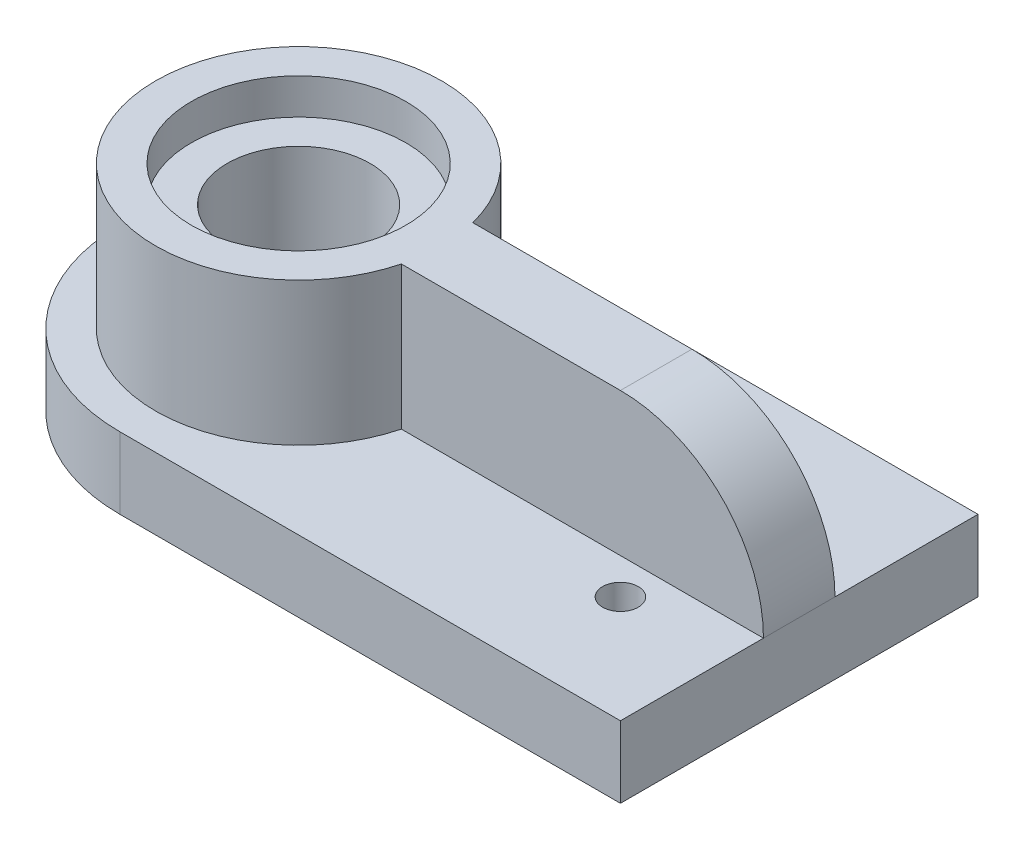
ISO-10303-21;
HEADER;
FILE_DESCRIPTION(('STEP AP214'),'2;1');
FILE_NAME('part.step','',(''),(''),'','','');
FILE_SCHEMA(('AUTOMOTIVE_DESIGN { 1 0 10303 214 1 1 1 1 }'));
ENDSEC;
DATA;
#1=APPLICATION_CONTEXT('core data for automotive mechanical design processes');
#2=APPLICATION_PROTOCOL_DEFINITION('international standard','automotive_design',2000,#1);
#3=PRODUCT_CONTEXT('',#1,'mechanical');
#4=PRODUCT('Part','Part','',(#3));
#5=PRODUCT_RELATED_PRODUCT_CATEGORY('part','',(#4));
#6=PRODUCT_DEFINITION_FORMATION('','',#4);
#7=PRODUCT_DEFINITION_CONTEXT('part definition',#1,'design');
#8=PRODUCT_DEFINITION('design','',#6,#7);
#9=PRODUCT_DEFINITION_SHAPE('','',#8);
#10=(LENGTH_UNIT() NAMED_UNIT(*) SI_UNIT(.MILLI.,.METRE.));
#11=(NAMED_UNIT(*) PLANE_ANGLE_UNIT() SI_UNIT($,.RADIAN.));
#12=(NAMED_UNIT(*) SI_UNIT($,.STERADIAN.) SOLID_ANGLE_UNIT());
#13=UNCERTAINTY_MEASURE_WITH_UNIT(LENGTH_MEASURE(1.E-05),#10,'distance_accuracy_value','');
#14=(GEOMETRIC_REPRESENTATION_CONTEXT(3) GLOBAL_UNCERTAINTY_ASSIGNED_CONTEXT((#13)) GLOBAL_UNIT_ASSIGNED_CONTEXT((#10,
#11,#12)) REPRESENTATION_CONTEXT('',''));
#15=CARTESIAN_POINT('',(0.,0.,0.));
#16=DIRECTION('',(0.,0.,1.));
#17=DIRECTION('',(1.,0.,0.));
#18=AXIS2_PLACEMENT_3D('',#15,#16,#17);
#19=CARTESIAN_POINT('',(25.,30.,-25.));
#20=DIRECTION('',(0.,-1.,0.));
#21=DIRECTION('',(0.,0.,-1.));
#22=AXIS2_PLACEMENT_3D('',#19,#20,#21);
#23=CYLINDRICAL_SURFACE('',#22,10.);
#24=CARTESIAN_POINT('',(25.,0.,-25.));
#25=DIRECTION('',(0.,1.,0.));
#26=DIRECTION('',(0.,0.,1.));
#27=AXIS2_PLACEMENT_3D('',#24,#25,#26);
#28=CIRCLE('',#27,10.);
#29=CARTESIAN_POINT('',(25.,0.,-15.));
#30=VERTEX_POINT('',#29);
#31=EDGE_CURVE('E135',#30,#30,#28,.T.);
#32=ORIENTED_EDGE('',*,*,#31,.F.);
#33=EDGE_LOOP('',(#32));
#34=FACE_BOUND('',#33,.T.);
#35=CARTESIAN_POINT('',(25.,25.,-25.));
#36=DIRECTION('',(0.,1.,0.));
#37=DIRECTION('',(0.,0.,1.));
#38=AXIS2_PLACEMENT_3D('',#35,#36,#37);
#39=CIRCLE('',#38,10.);
#40=CARTESIAN_POINT('',(25.,25.,-15.));
#41=VERTEX_POINT('',#40);
#42=EDGE_CURVE('E417',#41,#41,#39,.T.);
#43=ORIENTED_EDGE('',*,*,#42,.T.);
#44=EDGE_LOOP('',(#43));
#45=FACE_BOUND('',#44,.T.);
#46=ADVANCED_FACE('F47',(#34,#45),#23,.F.);
#47=CARTESIAN_POINT('',(25.,10.,-25.));
#48=DIRECTION('',(0.,-1.,0.));
#49=DIRECTION('',(0.,0.,-1.));
#50=AXIS2_PLACEMENT_3D('',#47,#48,#49);
#51=CYLINDRICAL_SURFACE('',#50,25.);
#52=DIRECTION('',(0.,1.,0.));
#53=VECTOR('',#52,1.);
#54=CARTESIAN_POINT('',(25.,10.,0.));
#55=LINE('',#54,#53);
#56=CARTESIAN_POINT('',(25.,10.,0.));
#57=VERTEX_POINT('',#56);
#58=CARTESIAN_POINT('',(25.,0.,0.));
#59=VERTEX_POINT('',#58);
#60=EDGE_CURVE('E183',#57,#59,#55,.F.);
#61=ORIENTED_EDGE('',*,*,#60,.F.);
#62=CARTESIAN_POINT('',(25.,10.,-25.));
#63=DIRECTION('',(0.,1.,0.));
#64=DIRECTION('',(0.,0.,1.));
#65=AXIS2_PLACEMENT_3D('',#62,#63,#64);
#66=CIRCLE('',#65,25.);
#67=CARTESIAN_POINT('',(25.,10.,-50.));
#68=VERTEX_POINT('',#67);
#69=EDGE_CURVE('E189',#68,#57,#66,.T.);
#70=ORIENTED_EDGE('',*,*,#69,.F.);
#71=DIRECTION('',(0.,-1.,0.));
#72=VECTOR('',#71,1.);
#73=CARTESIAN_POINT('',(25.,10.,-50.));
#74=LINE('',#73,#72);
#75=CARTESIAN_POINT('',(25.,0.,-50.));
#76=VERTEX_POINT('',#75);
#77=EDGE_CURVE('E186',#76,#68,#74,.F.);
#78=ORIENTED_EDGE('',*,*,#77,.F.);
#79=CARTESIAN_POINT('',(25.,0.,-25.));
#80=DIRECTION('',(0.,1.,0.));
#81=DIRECTION('',(0.,0.,1.));
#82=AXIS2_PLACEMENT_3D('',#79,#80,#81);
#83=CIRCLE('',#82,25.);
#84=EDGE_CURVE('E191',#59,#76,#83,.F.);
#85=ORIENTED_EDGE('',*,*,#84,.F.);
#86=EDGE_LOOP('',(#61,#70,#78,#85));
#87=FACE_BOUND('',#86,.T.);
#88=ADVANCED_FACE('F218',(#87),#51,.T.);
#89=CARTESIAN_POINT('',(0.,10.,-50.));
#90=DIRECTION('',(0.,0.,-1.));
#91=DIRECTION('',(-1.,0.,0.));
#92=AXIS2_PLACEMENT_3D('',#89,#90,#91);
#93=PLANE('',#92);
#94=DIRECTION('',(1.,0.,0.));
#95=VECTOR('',#94,1.);
#96=CARTESIAN_POINT('',(0.,0.,-50.));
#97=LINE('',#96,#95);
#98=CARTESIAN_POINT('',(95.,0.,-50.));
#99=VERTEX_POINT('',#98);
#100=EDGE_CURVE('E172',#76,#99,#97,.T.);
#101=ORIENTED_EDGE('',*,*,#100,.F.);
#102=ORIENTED_EDGE('',*,*,#77,.T.);
#103=DIRECTION('',(1.,0.,0.));
#104=VECTOR('',#103,1.);
#105=CARTESIAN_POINT('',(0.,10.,-50.));
#106=LINE('',#105,#104);
#107=CARTESIAN_POINT('',(95.,10.,-50.));
#108=VERTEX_POINT('',#107);
#109=EDGE_CURVE('E159',#68,#108,#106,.T.);
#110=ORIENTED_EDGE('',*,*,#109,.T.);
#111=DIRECTION('',(0.,-1.,0.));
#112=VECTOR('',#111,1.);
#113=CARTESIAN_POINT('',(95.,10.,-50.));
#114=LINE('',#113,#112);
#115=EDGE_CURVE('E180',#108,#99,#114,.T.);
#116=ORIENTED_EDGE('',*,*,#115,.T.);
#117=EDGE_LOOP('',(#101,#102,#110,#116));
#118=FACE_BOUND('',#117,.T.);
#119=ADVANCED_FACE('F224',(#118),#93,.T.);
#120=CARTESIAN_POINT('',(0.,10.,0.));
#121=DIRECTION('',(0.,0.,-1.));
#122=DIRECTION('',(-1.,0.,0.));
#123=AXIS2_PLACEMENT_3D('',#120,#121,#122);
#124=PLANE('',#123);
#125=DIRECTION('',(1.,0.,0.));
#126=VECTOR('',#125,1.);
#127=CARTESIAN_POINT('',(0.,10.,0.));
#128=LINE('',#127,#126);
#129=CARTESIAN_POINT('',(95.,10.,0.));
#130=VERTEX_POINT('',#129);
#131=EDGE_CURVE('E162',#57,#130,#128,.T.);
#132=ORIENTED_EDGE('',*,*,#131,.F.);
#133=ORIENTED_EDGE('',*,*,#60,.T.);
#134=DIRECTION('',(1.,0.,0.));
#135=VECTOR('',#134,1.);
#136=CARTESIAN_POINT('',(0.,0.,0.));
#137=LINE('',#136,#135);
#138=CARTESIAN_POINT('',(95.,0.,0.));
#139=VERTEX_POINT('',#138);
#140=EDGE_CURVE('E175',#59,#139,#137,.T.);
#141=ORIENTED_EDGE('',*,*,#140,.T.);
#142=DIRECTION('',(0.,-1.,0.));
#143=VECTOR('',#142,1.);
#144=CARTESIAN_POINT('',(95.,10.,0.));
#145=LINE('',#144,#143);
#146=EDGE_CURVE('E166',#130,#139,#145,.T.);
#147=ORIENTED_EDGE('',*,*,#146,.F.);
#148=EDGE_LOOP('',(#132,#133,#141,#147));
#149=FACE_BOUND('',#148,.T.);
#150=ADVANCED_FACE('F246',(#149),#124,.F.);
#151=CARTESIAN_POINT('',(95.,10.,0.));
#152=DIRECTION('',(-1.,0.,0.));
#153=DIRECTION('',(0.,0.,1.));
#154=AXIS2_PLACEMENT_3D('',#151,#152,#153);
#155=PLANE('',#154);
#156=DIRECTION('',(0.,0.,-1.));
#157=VECTOR('',#156,1.);
#158=CARTESIAN_POINT('',(95.,10.,0.));
#159=LINE('',#158,#157);
#160=CARTESIAN_POINT('',(95.,10.,-30.));
#161=VERTEX_POINT('',#160);
#162=EDGE_CURVE('E156',#161,#108,#159,.T.);
#163=ORIENTED_EDGE('',*,*,#162,.F.);
#164=DIRECTION('',(0.,0.,-1.));
#165=VECTOR('',#164,1.);
#166=CARTESIAN_POINT('',(95.,10.,-20.));
#167=LINE('',#166,#165);
#168=CARTESIAN_POINT('',(95.,10.,-20.));
#169=VERTEX_POINT('',#168);
#170=EDGE_CURVE('E55',#161,#169,#167,.F.);
#171=ORIENTED_EDGE('',*,*,#170,.T.);
#172=EDGE_CURVE('E160',#130,#169,#159,.T.);
#173=ORIENTED_EDGE('',*,*,#172,.F.);
#174=ORIENTED_EDGE('',*,*,#146,.T.);
#175=DIRECTION('',(0.,0.,-1.));
#176=VECTOR('',#175,1.);
#177=CARTESIAN_POINT('',(95.,0.,0.));
#178=LINE('',#177,#176);
#179=EDGE_CURVE('E150',#139,#99,#178,.T.);
#180=ORIENTED_EDGE('',*,*,#179,.T.);
#181=ORIENTED_EDGE('',*,*,#115,.F.);
#182=EDGE_LOOP('',(#163,#171,#173,#174,#180,#181));
#183=FACE_BOUND('',#182,.T.);
#184=ADVANCED_FACE('F198',(#183),#155,.F.);
#185=CARTESIAN_POINT('',(80.,10.,-35.));
#186=DIRECTION('',(0.,-1.,0.));
#187=DIRECTION('',(0.,0.,-1.));
#188=AXIS2_PLACEMENT_3D('',#185,#186,#187);
#189=CYLINDRICAL_SURFACE('',#188,2.50000000000001);
#190=CARTESIAN_POINT('',(80.,10.,-35.));
#191=DIRECTION('',(0.,1.,0.));
#192=DIRECTION('',(0.,0.,1.));
#193=AXIS2_PLACEMENT_3D('',#190,#191,#192);
#194=CIRCLE('',#193,2.50000000000001);
#195=CARTESIAN_POINT('',(80.,10.,-32.5));
#196=VERTEX_POINT('',#195);
#197=EDGE_CURVE('E149',#196,#196,#194,.T.);
#198=ORIENTED_EDGE('',*,*,#197,.T.);
#199=EDGE_LOOP('',(#198));
#200=FACE_BOUND('',#199,.T.);
#201=CARTESIAN_POINT('',(80.,0.,-35.));
#202=DIRECTION('',(0.,1.,0.));
#203=DIRECTION('',(0.,0.,1.));
#204=AXIS2_PLACEMENT_3D('',#201,#202,#203);
#205=CIRCLE('',#204,2.50000000000001);
#206=CARTESIAN_POINT('',(80.,0.,-32.5));
#207=VERTEX_POINT('',#206);
#208=EDGE_CURVE('E169',#207,#207,#205,.T.);
#209=ORIENTED_EDGE('',*,*,#208,.F.);
#210=EDGE_LOOP('',(#209));
#211=FACE_BOUND('',#210,.T.);
#212=ADVANCED_FACE('F245',(#200,#211),#189,.F.);
#213=CARTESIAN_POINT('',(80.,10.,-15.));
#214=DIRECTION('',(0.,-1.,0.));
#215=DIRECTION('',(0.,0.,-1.));
#216=AXIS2_PLACEMENT_3D('',#213,#214,#215);
#217=CYLINDRICAL_SURFACE('',#216,2.49999999999999);
#218=CARTESIAN_POINT('',(80.,10.,-15.));
#219=DIRECTION('',(0.,1.,0.));
#220=DIRECTION('',(0.,0.,1.));
#221=AXIS2_PLACEMENT_3D('',#218,#219,#220);
#222=CIRCLE('',#221,2.49999999999999);
#223=CARTESIAN_POINT('',(80.,10.,-12.5));
#224=VERTEX_POINT('',#223);
#225=EDGE_CURVE('E146',#224,#224,#222,.T.);
#226=ORIENTED_EDGE('',*,*,#225,.T.);
#227=EDGE_LOOP('',(#226));
#228=FACE_BOUND('',#227,.T.);
#229=CARTESIAN_POINT('',(80.,0.,-15.));
#230=DIRECTION('',(0.,1.,0.));
#231=DIRECTION('',(0.,0.,1.));
#232=AXIS2_PLACEMENT_3D('',#229,#230,#231);
#233=CIRCLE('',#232,2.49999999999999);
#234=CARTESIAN_POINT('',(80.,0.,-12.5));
#235=VERTEX_POINT('',#234);
#236=EDGE_CURVE('E122',#235,#235,#233,.T.);
#237=ORIENTED_EDGE('',*,*,#236,.F.);
#238=EDGE_LOOP('',(#237));
#239=FACE_BOUND('',#238,.T.);
#240=ADVANCED_FACE('F238',(#228,#239),#217,.F.);
#241=CARTESIAN_POINT('',(0.,10.,0.));
#242=DIRECTION('',(0.,1.,0.));
#243=DIRECTION('',(0.,0.,1.));
#244=AXIS2_PLACEMENT_3D('',#241,#242,#243);
#245=PLANE('',#244);
#246=ORIENTED_EDGE('',*,*,#225,.F.);
#247=EDGE_LOOP('',(#246));
#248=FACE_BOUND('',#247,.T.);
#249=ORIENTED_EDGE('',*,*,#197,.F.);
#250=EDGE_LOOP('',(#249));
#251=FACE_BOUND('',#250,.T.);
#252=ORIENTED_EDGE('',*,*,#109,.F.);
#253=ORIENTED_EDGE('',*,*,#69,.T.);
#254=ORIENTED_EDGE('',*,*,#131,.T.);
#255=ORIENTED_EDGE('',*,*,#172,.T.);
#256=DIRECTION('',(-1.,0.,0.));
#257=VECTOR('',#256,1.);
#258=CARTESIAN_POINT('',(0.,10.,-20.));
#259=LINE('',#258,#257);
#260=CARTESIAN_POINT('',(44.3649167310371,10.,-20.));
#261=VERTEX_POINT('',#260);
#262=EDGE_CURVE('E164',#169,#261,#259,.T.);
#263=ORIENTED_EDGE('',*,*,#262,.T.);
#264=CARTESIAN_POINT('',(25.,10.,-25.));
#265=DIRECTION('',(0.,1.,0.));
#266=DIRECTION('',(0.,0.,1.));
#267=AXIS2_PLACEMENT_3D('',#264,#265,#266);
#268=CIRCLE('',#267,20.);
#269=CARTESIAN_POINT('',(44.3649167310371,10.,-30.));
#270=VERTEX_POINT('',#269);
#271=EDGE_CURVE('E153',#270,#261,#268,.T.);
#272=ORIENTED_EDGE('',*,*,#271,.F.);
#273=DIRECTION('',(1.,0.,0.));
#274=VECTOR('',#273,1.);
#275=CARTESIAN_POINT('',(0.,10.,-30.));
#276=LINE('',#275,#274);
#277=EDGE_CURVE('E119',#270,#161,#276,.T.);
#278=ORIENTED_EDGE('',*,*,#277,.T.);
#279=ORIENTED_EDGE('',*,*,#162,.T.);
#280=EDGE_LOOP('',(#252,#253,#254,#255,#263,#272,#278,#279));
#281=FACE_BOUND('',#280,.T.);
#282=ADVANCED_FACE('F203',(#248,#251,#281),#245,.T.);
#283=CARTESIAN_POINT('',(0.,0.,0.));
#284=DIRECTION('',(0.,1.,0.));
#285=DIRECTION('',(0.,0.,1.));
#286=AXIS2_PLACEMENT_3D('',#283,#284,#285);
#287=PLANE('',#286);
#288=ORIENTED_EDGE('',*,*,#140,.F.);
#289=ORIENTED_EDGE('',*,*,#84,.T.);
#290=ORIENTED_EDGE('',*,*,#100,.T.);
#291=ORIENTED_EDGE('',*,*,#179,.F.);
#292=EDGE_LOOP('',(#288,#289,#290,#291));
#293=FACE_BOUND('',#292,.T.);
#294=ORIENTED_EDGE('',*,*,#236,.T.);
#295=EDGE_LOOP('',(#294));
#296=FACE_BOUND('',#295,.T.);
#297=ORIENTED_EDGE('',*,*,#208,.T.);
#298=EDGE_LOOP('',(#297));
#299=FACE_BOUND('',#298,.T.);
#300=ORIENTED_EDGE('',*,*,#31,.T.);
#301=EDGE_LOOP('',(#300));
#302=FACE_BOUND('',#301,.T.);
#303=ADVANCED_FACE('F235',(#293,#296,#299,#302),#287,.F.);
#304=CARTESIAN_POINT('',(0.,30.,-30.));
#305=DIRECTION('',(0.,0.,-1.));
#306=DIRECTION('',(-1.,0.,0.));
#307=AXIS2_PLACEMENT_3D('',#304,#305,#306);
#308=PLANE('',#307);
#309=DIRECTION('',(1.,0.,0.));
#310=VECTOR('',#309,1.);
#311=CARTESIAN_POINT('',(0.,30.,-30.));
#312=LINE('',#311,#310);
#313=CARTESIAN_POINT('',(44.3649167310371,30.,-30.));
#314=VERTEX_POINT('',#313);
#315=CARTESIAN_POINT('',(75.,30.,-30.));
#316=VERTEX_POINT('',#315);
#317=EDGE_CURVE('E117',#314,#316,#312,.T.);
#318=ORIENTED_EDGE('',*,*,#317,.T.);
#319=CARTESIAN_POINT('',(75.,10.,-30.));
#320=DIRECTION('',(0.,0.,-1.));
#321=DIRECTION('',(-1.,0.,0.));
#322=AXIS2_PLACEMENT_3D('',#319,#320,#321);
#323=CIRCLE('',#322,20.);
#324=EDGE_CURVE('E68',#316,#161,#323,.T.);
#325=ORIENTED_EDGE('',*,*,#324,.T.);
#326=ORIENTED_EDGE('',*,*,#277,.F.);
#327=DIRECTION('',(0.,-1.,0.));
#328=VECTOR('',#327,1.);
#329=CARTESIAN_POINT('',(44.3649167310371,30.,-30.));
#330=LINE('',#329,#328);
#331=EDGE_CURVE('E113',#314,#270,#330,.T.);
#332=ORIENTED_EDGE('',*,*,#331,.F.);
#333=EDGE_LOOP('',(#318,#325,#326,#332));
#334=FACE_BOUND('',#333,.T.);
#335=ADVANCED_FACE('F115',(#334),#308,.T.);
#336=CARTESIAN_POINT('',(25.,30.,-25.));
#337=DIRECTION('',(0.,-1.,0.));
#338=DIRECTION('',(0.,0.,-1.));
#339=AXIS2_PLACEMENT_3D('',#336,#337,#338);
#340=CYLINDRICAL_SURFACE('',#339,20.);
#341=ORIENTED_EDGE('',*,*,#271,.T.);
#342=DIRECTION('',(0.,-1.,0.));
#343=VECTOR('',#342,1.);
#344=CARTESIAN_POINT('',(44.3649167310371,30.,-20.));
#345=LINE('',#344,#343);
#346=CARTESIAN_POINT('',(44.3649167310371,30.,-20.));
#347=VERTEX_POINT('',#346);
#348=EDGE_CURVE('E123',#347,#261,#345,.T.);
#349=ORIENTED_EDGE('',*,*,#348,.F.);
#350=CARTESIAN_POINT('',(25.,30.,-25.));
#351=DIRECTION('',(0.,1.,0.));
#352=DIRECTION('',(0.,0.,1.));
#353=AXIS2_PLACEMENT_3D('',#350,#351,#352);
#354=CIRCLE('',#353,20.);
#355=EDGE_CURVE('E127',#314,#347,#354,.T.);
#356=ORIENTED_EDGE('',*,*,#355,.F.);
#357=ORIENTED_EDGE('',*,*,#331,.T.);
#358=EDGE_LOOP('',(#341,#349,#356,#357));
#359=FACE_BOUND('',#358,.T.);
#360=ADVANCED_FACE('F128',(#359),#340,.T.);
#361=CARTESIAN_POINT('',(0.,30.,-20.));
#362=DIRECTION('',(0.,0.,1.));
#363=DIRECTION('',(1.,0.,0.));
#364=AXIS2_PLACEMENT_3D('',#361,#362,#363);
#365=PLANE('',#364);
#366=ORIENTED_EDGE('',*,*,#262,.F.);
#367=CARTESIAN_POINT('',(75.,10.,-20.));
#368=DIRECTION('',(0.,0.,1.));
#369=DIRECTION('',(1.,0.,0.));
#370=AXIS2_PLACEMENT_3D('',#367,#368,#369);
#371=CIRCLE('',#370,20.);
#372=CARTESIAN_POINT('',(75.,30.,-20.));
#373=VERTEX_POINT('',#372);
#374=EDGE_CURVE('E12',#169,#373,#371,.T.);
#375=ORIENTED_EDGE('',*,*,#374,.T.);
#376=DIRECTION('',(-1.,0.,0.));
#377=VECTOR('',#376,1.);
#378=CARTESIAN_POINT('',(0.,30.,-20.));
#379=LINE('',#378,#377);
#380=EDGE_CURVE('E131',#373,#347,#379,.T.);
#381=ORIENTED_EDGE('',*,*,#380,.T.);
#382=ORIENTED_EDGE('',*,*,#348,.T.);
#383=EDGE_LOOP('',(#366,#375,#381,#382));
#384=FACE_BOUND('',#383,.T.);
#385=ADVANCED_FACE('F205',(#384),#365,.T.);
#386=CARTESIAN_POINT('',(0.,30.,0.));
#387=DIRECTION('',(0.,1.,0.));
#388=DIRECTION('',(0.,0.,1.));
#389=AXIS2_PLACEMENT_3D('',#386,#387,#388);
#390=PLANE('',#389);
#391=CARTESIAN_POINT('',(25.,30.,-25.));
#392=DIRECTION('',(0.,1.,0.));
#393=DIRECTION('',(0.,0.,1.));
#394=AXIS2_PLACEMENT_3D('',#391,#392,#393);
#395=CIRCLE('',#394,15.);
#396=CARTESIAN_POINT('',(25.,30.,-10.));
#397=VERTEX_POINT('',#396);
#398=EDGE_CURVE('E141',#397,#397,#395,.T.);
#399=ORIENTED_EDGE('',*,*,#398,.F.);
#400=EDGE_LOOP('',(#399));
#401=FACE_BOUND('',#400,.T.);
#402=ORIENTED_EDGE('',*,*,#380,.F.);
#403=DIRECTION('',(0.,0.,-1.));
#404=VECTOR('',#403,1.);
#405=CARTESIAN_POINT('',(75.,30.,-30.));
#406=LINE('',#405,#404);
#407=EDGE_CURVE('E134',#373,#316,#406,.T.);
#408=ORIENTED_EDGE('',*,*,#407,.T.);
#409=ORIENTED_EDGE('',*,*,#317,.F.);
#410=ORIENTED_EDGE('',*,*,#355,.T.);
#411=EDGE_LOOP('',(#402,#408,#409,#410));
#412=FACE_BOUND('',#411,.T.);
#413=ADVANCED_FACE('F133',(#401,#412),#390,.T.);
#414=CARTESIAN_POINT('',(75.,10.,0.));
#415=DIRECTION('',(0.,0.,1.));
#416=DIRECTION('',(1.,0.,0.));
#417=AXIS2_PLACEMENT_3D('',#414,#415,#416);
#418=CYLINDRICAL_SURFACE('',#417,20.);
#419=ORIENTED_EDGE('',*,*,#374,.F.);
#420=ORIENTED_EDGE('',*,*,#170,.F.);
#421=ORIENTED_EDGE('',*,*,#324,.F.);
#422=ORIENTED_EDGE('',*,*,#407,.F.);
#423=EDGE_LOOP('',(#419,#420,#421,#422));
#424=FACE_BOUND('',#423,.T.);
#425=ADVANCED_FACE('F49',(#424),#418,.T.);
#426=CARTESIAN_POINT('',(25.,25.,-25.));
#427=DIRECTION('',(0.,1.,0.));
#428=DIRECTION('',(0.,0.,1.));
#429=AXIS2_PLACEMENT_3D('',#426,#427,#428);
#430=CYLINDRICAL_SURFACE('',#429,15.);
#431=CARTESIAN_POINT('',(25.,25.,-25.));
#432=DIRECTION('',(0.,1.,0.));
#433=DIRECTION('',(0.,0.,1.));
#434=AXIS2_PLACEMENT_3D('',#431,#432,#433);
#435=CIRCLE('',#434,15.);
#436=CARTESIAN_POINT('',(25.,25.,-10.));
#437=VERTEX_POINT('',#436);
#438=EDGE_CURVE('E138',#437,#437,#435,.T.);
#439=ORIENTED_EDGE('',*,*,#438,.F.);
#440=EDGE_LOOP('',(#439));
#441=FACE_BOUND('',#440,.T.);
#442=ORIENTED_EDGE('',*,*,#398,.T.);
#443=EDGE_LOOP('',(#442));
#444=FACE_BOUND('',#443,.T.);
#445=ADVANCED_FACE('F207',(#441,#444),#430,.F.);
#446=CARTESIAN_POINT('',(25.,25.,-25.));
#447=DIRECTION('',(0.,1.,0.));
#448=DIRECTION('',(0.,0.,1.));
#449=AXIS2_PLACEMENT_3D('',#446,#447,#448);
#450=PLANE('',#449);
#451=ORIENTED_EDGE('',*,*,#42,.F.);
#452=EDGE_LOOP('',(#451));
#453=FACE_BOUND('',#452,.T.);
#454=ORIENTED_EDGE('',*,*,#438,.T.);
#455=EDGE_LOOP('',(#454));
#456=FACE_BOUND('',#455,.T.);
#457=ADVANCED_FACE('F212',(#453,#456),#450,.T.);
#458=CLOSED_SHELL('',(#46,#88,#119,#150,#184,#212,#240,#282,#303,#335,#360,#385,#413,#425,#445,#457));
#459=MANIFOLD_SOLID_BREP('B2',#458);
#460=ADVANCED_BREP_SHAPE_REPRESENTATION('',(#18,#459),#14);
#461=SHAPE_DEFINITION_REPRESENTATION(#9,#460);
ENDSEC;
END-ISO-10303-21;
